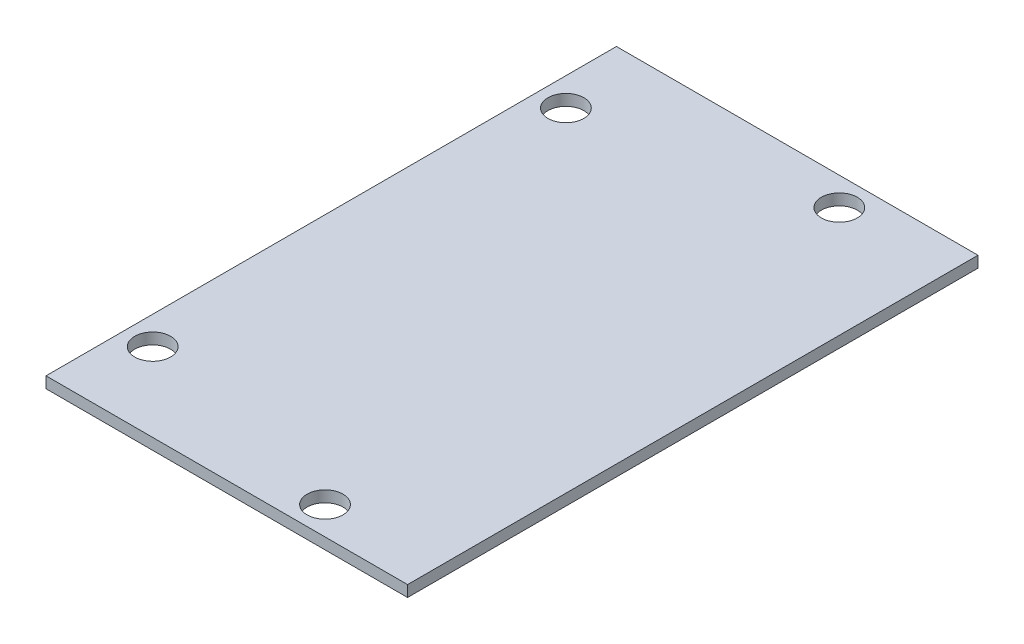
ISO-10303-21;
HEADER;
FILE_DESCRIPTION(('STEP AP214'),'2;1');
FILE_NAME('part.step','',(''),(''),'','','');
FILE_SCHEMA(('AUTOMOTIVE_DESIGN { 1 0 10303 214 1 1 1 1 }'));
ENDSEC;
DATA;
#1=APPLICATION_CONTEXT('core data for automotive mechanical design processes');
#2=APPLICATION_PROTOCOL_DEFINITION('international standard','automotive_design',2000,#1);
#3=PRODUCT_CONTEXT('',#1,'mechanical');
#4=PRODUCT('Part','Part','',(#3));
#5=PRODUCT_RELATED_PRODUCT_CATEGORY('part','',(#4));
#6=PRODUCT_DEFINITION_FORMATION('','',#4);
#7=PRODUCT_DEFINITION_CONTEXT('part definition',#1,'design');
#8=PRODUCT_DEFINITION('design','',#6,#7);
#9=PRODUCT_DEFINITION_SHAPE('','',#8);
#10=(LENGTH_UNIT() NAMED_UNIT(*) SI_UNIT(.MILLI.,.METRE.));
#11=(NAMED_UNIT(*) PLANE_ANGLE_UNIT() SI_UNIT($,.RADIAN.));
#12=(NAMED_UNIT(*) SI_UNIT($,.STERADIAN.) SOLID_ANGLE_UNIT());
#13=UNCERTAINTY_MEASURE_WITH_UNIT(LENGTH_MEASURE(1.E-05),#10,'distance_accuracy_value','');
#14=(GEOMETRIC_REPRESENTATION_CONTEXT(3) GLOBAL_UNCERTAINTY_ASSIGNED_CONTEXT((#13)) GLOBAL_UNIT_ASSIGNED_CONTEXT((#10,
#11,#12)) REPRESENTATION_CONTEXT('',''));
#15=CARTESIAN_POINT('',(0.,0.,0.));
#16=DIRECTION('',(0.,0.,1.));
#17=DIRECTION('',(1.,0.,0.));
#18=AXIS2_PLACEMENT_3D('',#15,#16,#17);
#19=CARTESIAN_POINT('',(-22.3500000000001,1.,35.8000000000002));
#20=DIRECTION('',(0.,1.,0.));
#21=DIRECTION('',(0.,0.,1.));
#22=AXIS2_PLACEMENT_3D('',#19,#20,#21);
#23=PLANE('',#22);
#24=CARTESIAN_POINT('',(-19.8500000000001,1.,-8.00000000000003));
#25=DIRECTION('',(0.,1.,0.));
#26=DIRECTION('',(0.,0.,1.));
#27=AXIS2_PLACEMENT_3D('',#24,#25,#26);
#28=CIRCLE('',#27,1.6);
#29=CARTESIAN_POINT('',(-19.8500000000001,1.,-6.40000000000003));
#30=VERTEX_POINT('',#29);
#31=EDGE_CURVE('E118',#30,#30,#28,.T.);
#32=ORIENTED_EDGE('',*,*,#31,.F.);
#33=EDGE_LOOP('',(#32));
#34=FACE_BOUND('',#33,.T.);
#35=CARTESIAN_POINT('',(0.,1.,33.3));
#36=DIRECTION('',(0.,1.,0.));
#37=DIRECTION('',(0.,0.,1.));
#38=AXIS2_PLACEMENT_3D('',#35,#36,#37);
#39=CIRCLE('',#38,1.60000000000004);
#40=CARTESIAN_POINT('',(0.,1.,34.9));
#41=VERTEX_POINT('',#40);
#42=EDGE_CURVE('E97',#41,#41,#39,.T.);
#43=ORIENTED_EDGE('',*,*,#42,.F.);
#44=EDGE_LOOP('',(#43));
#45=FACE_BOUND('',#44,.T.);
#46=DIRECTION('',(0.,0.,1.));
#47=VECTOR('',#46,1.);
#48=CARTESIAN_POINT('',(-22.3500000000001,1.,-15.));
#49=LINE('',#48,#47);
#50=CARTESIAN_POINT('',(-22.3500000000001,1.,-15.));
#51=VERTEX_POINT('',#50);
#52=CARTESIAN_POINT('',(-22.3500000000001,1.,35.8000000000002));
#53=VERTEX_POINT('',#52);
#54=EDGE_CURVE('E82',#51,#53,#49,.T.);
#55=ORIENTED_EDGE('',*,*,#54,.T.);
#56=DIRECTION('',(1.,0.,0.));
#57=VECTOR('',#56,1.);
#58=CARTESIAN_POINT('',(-22.3500000000001,1.,35.8000000000002));
#59=LINE('',#58,#57);
#60=CARTESIAN_POINT('',(9.84999999999996,1.,35.8));
#61=VERTEX_POINT('',#60);
#62=EDGE_CURVE('E77',#53,#61,#59,.T.);
#63=ORIENTED_EDGE('',*,*,#62,.T.);
#64=DIRECTION('',(0.,0.,-1.));
#65=VECTOR('',#64,1.);
#66=CARTESIAN_POINT('',(9.84999999999995,1.,-15.0000000000001));
#67=LINE('',#66,#65);
#68=CARTESIAN_POINT('',(9.84999999999995,1.,-15.0000000000001));
#69=VERTEX_POINT('',#68);
#70=EDGE_CURVE('E80',#61,#69,#67,.T.);
#71=ORIENTED_EDGE('',*,*,#70,.T.);
#72=DIRECTION('',(-1.,0.,0.));
#73=VECTOR('',#72,1.);
#74=CARTESIAN_POINT('',(-22.3500000000001,1.,-15.));
#75=LINE('',#74,#73);
#76=EDGE_CURVE('E47',#69,#51,#75,.T.);
#77=ORIENTED_EDGE('',*,*,#76,.T.);
#78=EDGE_LOOP('',(#55,#63,#71,#77));
#79=FACE_BOUND('',#78,.T.);
#80=CARTESIAN_POINT('',(0.,1.,-12.5000000000001));
#81=DIRECTION('',(0.,1.,0.));
#82=DIRECTION('',(0.,0.,1.));
#83=AXIS2_PLACEMENT_3D('',#80,#81,#82);
#84=CIRCLE('',#83,1.60000000000001);
#85=CARTESIAN_POINT('',(0.,1.,-10.9000000000001));
#86=VERTEX_POINT('',#85);
#87=EDGE_CURVE('E112',#86,#86,#84,.T.);
#88=ORIENTED_EDGE('',*,*,#87,.F.);
#89=EDGE_LOOP('',(#88));
#90=FACE_BOUND('',#89,.T.);
#91=CARTESIAN_POINT('',(-19.8500000000001,1.,28.8000000000002));
#92=DIRECTION('',(0.,1.,0.));
#93=DIRECTION('',(0.,0.,1.));
#94=AXIS2_PLACEMENT_3D('',#91,#92,#93);
#95=CIRCLE('',#94,1.60000000000005);
#96=CARTESIAN_POINT('',(-19.8500000000001,1.,30.4000000000003));
#97=VERTEX_POINT('',#96);
#98=EDGE_CURVE('E124',#97,#97,#95,.T.);
#99=ORIENTED_EDGE('',*,*,#98,.F.);
#100=EDGE_LOOP('',(#99));
#101=FACE_BOUND('',#100,.T.);
#102=ADVANCED_FACE('F30',(#34,#45,#79,#90,#101),#23,.T.);
#103=CARTESIAN_POINT('',(-22.3500000000001,0.,35.8000000000002));
#104=DIRECTION('',(0.,1.,0.));
#105=DIRECTION('',(0.,0.,1.));
#106=AXIS2_PLACEMENT_3D('',#103,#104,#105);
#107=PLANE('',#106);
#108=CARTESIAN_POINT('',(-19.8500000000001,0.,-8.00000000000003));
#109=DIRECTION('',(0.,1.,0.));
#110=DIRECTION('',(0.,0.,1.));
#111=AXIS2_PLACEMENT_3D('',#108,#109,#110);
#112=CIRCLE('',#111,1.6);
#113=CARTESIAN_POINT('',(-19.8500000000001,0.,-6.40000000000003));
#114=VERTEX_POINT('',#113);
#115=EDGE_CURVE('E121',#114,#114,#112,.T.);
#116=ORIENTED_EDGE('',*,*,#115,.T.);
#117=EDGE_LOOP('',(#116));
#118=FACE_BOUND('',#117,.T.);
#119=CARTESIAN_POINT('',(0.,0.,33.3));
#120=DIRECTION('',(0.,1.,0.));
#121=DIRECTION('',(0.,0.,1.));
#122=AXIS2_PLACEMENT_3D('',#119,#120,#121);
#123=CIRCLE('',#122,1.60000000000004);
#124=CARTESIAN_POINT('',(0.,0.,34.9));
#125=VERTEX_POINT('',#124);
#126=EDGE_CURVE('E109',#125,#125,#123,.T.);
#127=ORIENTED_EDGE('',*,*,#126,.T.);
#128=EDGE_LOOP('',(#127));
#129=FACE_BOUND('',#128,.T.);
#130=DIRECTION('',(0.,0.,1.));
#131=VECTOR('',#130,1.);
#132=CARTESIAN_POINT('',(-22.3500000000001,0.,-15.));
#133=LINE('',#132,#131);
#134=CARTESIAN_POINT('',(-22.3500000000001,0.,-15.));
#135=VERTEX_POINT('',#134);
#136=CARTESIAN_POINT('',(-22.3500000000001,0.,35.8000000000002));
#137=VERTEX_POINT('',#136);
#138=EDGE_CURVE('E94',#135,#137,#133,.T.);
#139=ORIENTED_EDGE('',*,*,#138,.F.);
#140=DIRECTION('',(-1.,0.,0.));
#141=VECTOR('',#140,1.);
#142=CARTESIAN_POINT('',(-22.3500000000001,0.,-15.));
#143=LINE('',#142,#141);
#144=CARTESIAN_POINT('',(9.84999999999995,0.,-15.0000000000001));
#145=VERTEX_POINT('',#144);
#146=EDGE_CURVE('E70',#145,#135,#143,.T.);
#147=ORIENTED_EDGE('',*,*,#146,.F.);
#148=DIRECTION('',(0.,0.,-1.));
#149=VECTOR('',#148,1.);
#150=CARTESIAN_POINT('',(9.84999999999995,0.,-15.0000000000001));
#151=LINE('',#150,#149);
#152=CARTESIAN_POINT('',(9.84999999999996,0.,35.8));
#153=VERTEX_POINT('',#152);
#154=EDGE_CURVE('E64',#153,#145,#151,.T.);
#155=ORIENTED_EDGE('',*,*,#154,.F.);
#156=DIRECTION('',(1.,0.,0.));
#157=VECTOR('',#156,1.);
#158=CARTESIAN_POINT('',(-22.3500000000001,0.,35.8000000000002));
#159=LINE('',#158,#157);
#160=EDGE_CURVE('E86',#137,#153,#159,.T.);
#161=ORIENTED_EDGE('',*,*,#160,.F.);
#162=EDGE_LOOP('',(#139,#147,#155,#161));
#163=FACE_BOUND('',#162,.T.);
#164=CARTESIAN_POINT('',(0.,0.,-12.5000000000001));
#165=DIRECTION('',(0.,1.,0.));
#166=DIRECTION('',(0.,0.,1.));
#167=AXIS2_PLACEMENT_3D('',#164,#165,#166);
#168=CIRCLE('',#167,1.60000000000001);
#169=CARTESIAN_POINT('',(0.,0.,-10.9000000000001));
#170=VERTEX_POINT('',#169);
#171=EDGE_CURVE('E115',#170,#170,#168,.T.);
#172=ORIENTED_EDGE('',*,*,#171,.T.);
#173=EDGE_LOOP('',(#172));
#174=FACE_BOUND('',#173,.T.);
#175=CARTESIAN_POINT('',(-19.8500000000001,0.,28.8000000000002));
#176=DIRECTION('',(0.,1.,0.));
#177=DIRECTION('',(0.,0.,1.));
#178=AXIS2_PLACEMENT_3D('',#175,#176,#177);
#179=CIRCLE('',#178,1.60000000000005);
#180=CARTESIAN_POINT('',(-19.8500000000001,0.,30.4000000000003));
#181=VERTEX_POINT('',#180);
#182=EDGE_CURVE('E127',#181,#181,#179,.T.);
#183=ORIENTED_EDGE('',*,*,#182,.T.);
#184=EDGE_LOOP('',(#183));
#185=FACE_BOUND('',#184,.T.);
#186=ADVANCED_FACE('F105',(#118,#129,#163,#174,#185),#107,.F.);
#187=CARTESIAN_POINT('',(-22.3500000000001,1.,-15.));
#188=DIRECTION('',(1.,0.,0.));
#189=DIRECTION('',(0.,0.,-1.));
#190=AXIS2_PLACEMENT_3D('',#187,#188,#189);
#191=PLANE('',#190);
#192=ORIENTED_EDGE('',*,*,#138,.T.);
#193=DIRECTION('',(0.,-1.,0.));
#194=VECTOR('',#193,1.);
#195=CARTESIAN_POINT('',(-22.3500000000001,1.,35.8000000000002));
#196=LINE('',#195,#194);
#197=EDGE_CURVE('E11',#53,#137,#196,.T.);
#198=ORIENTED_EDGE('',*,*,#197,.F.);
#199=ORIENTED_EDGE('',*,*,#54,.F.);
#200=DIRECTION('',(0.,-1.,0.));
#201=VECTOR('',#200,1.);
#202=CARTESIAN_POINT('',(-22.3500000000001,1.,-15.));
#203=LINE('',#202,#201);
#204=EDGE_CURVE('E90',#51,#135,#203,.T.);
#205=ORIENTED_EDGE('',*,*,#204,.T.);
#206=EDGE_LOOP('',(#192,#198,#199,#205));
#207=FACE_BOUND('',#206,.T.);
#208=ADVANCED_FACE('F32',(#207),#191,.F.);
#209=CARTESIAN_POINT('',(-22.3500000000001,1.,35.8000000000002));
#210=DIRECTION('',(0.,0.,-1.));
#211=DIRECTION('',(-1.,0.,0.));
#212=AXIS2_PLACEMENT_3D('',#209,#210,#211);
#213=PLANE('',#212);
#214=ORIENTED_EDGE('',*,*,#160,.T.);
#215=DIRECTION('',(0.,-1.,0.));
#216=VECTOR('',#215,1.);
#217=CARTESIAN_POINT('',(9.84999999999996,1.,35.8));
#218=LINE('',#217,#216);
#219=EDGE_CURVE('E39',#61,#153,#218,.T.);
#220=ORIENTED_EDGE('',*,*,#219,.F.);
#221=ORIENTED_EDGE('',*,*,#62,.F.);
#222=ORIENTED_EDGE('',*,*,#197,.T.);
#223=EDGE_LOOP('',(#214,#220,#221,#222));
#224=FACE_BOUND('',#223,.T.);
#225=ADVANCED_FACE('F85',(#224),#213,.F.);
#226=CARTESIAN_POINT('',(9.84999999999995,1.,-15.0000000000001));
#227=DIRECTION('',(-1.,0.,0.));
#228=DIRECTION('',(0.,0.,1.));
#229=AXIS2_PLACEMENT_3D('',#226,#227,#228);
#230=PLANE('',#229);
#231=ORIENTED_EDGE('',*,*,#154,.T.);
#232=DIRECTION('',(0.,-1.,0.));
#233=VECTOR('',#232,1.);
#234=CARTESIAN_POINT('',(9.84999999999995,1.,-15.0000000000001));
#235=LINE('',#234,#233);
#236=EDGE_CURVE('E87',#69,#145,#235,.T.);
#237=ORIENTED_EDGE('',*,*,#236,.F.);
#238=ORIENTED_EDGE('',*,*,#70,.F.);
#239=ORIENTED_EDGE('',*,*,#219,.T.);
#240=EDGE_LOOP('',(#231,#237,#238,#239));
#241=FACE_BOUND('',#240,.T.);
#242=ADVANCED_FACE('F88',(#241),#230,.F.);
#243=CARTESIAN_POINT('',(-22.3500000000001,1.,-15.));
#244=DIRECTION('',(0.,0.,1.));
#245=DIRECTION('',(1.,0.,0.));
#246=AXIS2_PLACEMENT_3D('',#243,#244,#245);
#247=PLANE('',#246);
#248=ORIENTED_EDGE('',*,*,#146,.T.);
#249=ORIENTED_EDGE('',*,*,#204,.F.);
#250=ORIENTED_EDGE('',*,*,#76,.F.);
#251=ORIENTED_EDGE('',*,*,#236,.T.);
#252=EDGE_LOOP('',(#248,#249,#250,#251));
#253=FACE_BOUND('',#252,.T.);
#254=ADVANCED_FACE('F102',(#253),#247,.F.);
#255=CARTESIAN_POINT('',(0.,1.,33.3));
#256=DIRECTION('',(0.,-1.,0.));
#257=DIRECTION('',(0.,0.,-1.));
#258=AXIS2_PLACEMENT_3D('',#255,#256,#257);
#259=CYLINDRICAL_SURFACE('',#258,1.60000000000004);
#260=ORIENTED_EDGE('',*,*,#42,.T.);
#261=EDGE_LOOP('',(#260));
#262=FACE_BOUND('',#261,.T.);
#263=ORIENTED_EDGE('',*,*,#126,.F.);
#264=EDGE_LOOP('',(#263));
#265=FACE_BOUND('',#264,.T.);
#266=ADVANCED_FACE('F147',(#262,#265),#259,.F.);
#267=CARTESIAN_POINT('',(0.,1.,-12.5000000000001));
#268=DIRECTION('',(0.,-1.,0.));
#269=DIRECTION('',(0.,0.,-1.));
#270=AXIS2_PLACEMENT_3D('',#267,#268,#269);
#271=CYLINDRICAL_SURFACE('',#270,1.60000000000001);
#272=ORIENTED_EDGE('',*,*,#87,.T.);
#273=EDGE_LOOP('',(#272));
#274=FACE_BOUND('',#273,.T.);
#275=ORIENTED_EDGE('',*,*,#171,.F.);
#276=EDGE_LOOP('',(#275));
#277=FACE_BOUND('',#276,.T.);
#278=ADVANCED_FACE('F193',(#274,#277),#271,.F.);
#279=CARTESIAN_POINT('',(-19.8500000000001,1.,-8.00000000000003));
#280=DIRECTION('',(0.,-1.,0.));
#281=DIRECTION('',(0.,0.,-1.));
#282=AXIS2_PLACEMENT_3D('',#279,#280,#281);
#283=CYLINDRICAL_SURFACE('',#282,1.6);
#284=ORIENTED_EDGE('',*,*,#31,.T.);
#285=EDGE_LOOP('',(#284));
#286=FACE_BOUND('',#285,.T.);
#287=ORIENTED_EDGE('',*,*,#115,.F.);
#288=EDGE_LOOP('',(#287));
#289=FACE_BOUND('',#288,.T.);
#290=ADVANCED_FACE('F201',(#286,#289),#283,.F.);
#291=CARTESIAN_POINT('',(-19.8500000000001,1.,28.8000000000002));
#292=DIRECTION('',(0.,-1.,0.));
#293=DIRECTION('',(0.,0.,-1.));
#294=AXIS2_PLACEMENT_3D('',#291,#292,#293);
#295=CYLINDRICAL_SURFACE('',#294,1.60000000000005);
#296=ORIENTED_EDGE('',*,*,#98,.T.);
#297=EDGE_LOOP('',(#296));
#298=FACE_BOUND('',#297,.T.);
#299=ORIENTED_EDGE('',*,*,#182,.F.);
#300=EDGE_LOOP('',(#299));
#301=FACE_BOUND('',#300,.T.);
#302=ADVANCED_FACE('F133',(#298,#301),#295,.F.);
#303=CLOSED_SHELL('',(#102,#186,#208,#225,#242,#254,#266,#278,#290,#302));
#304=MANIFOLD_SOLID_BREP('B2',#303);
#305=ADVANCED_BREP_SHAPE_REPRESENTATION('',(#18,#304),#14);
#306=SHAPE_DEFINITION_REPRESENTATION(#9,#305);
ENDSEC;
END-ISO-10303-21;
